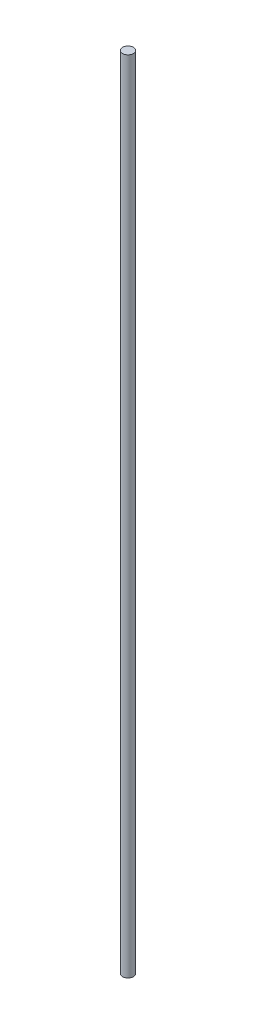
ISO-10303-21;
HEADER;
FILE_DESCRIPTION(('STEP AP214'),'2;1');
FILE_NAME('part.step','',(''),(''),'','','');
FILE_SCHEMA(('AUTOMOTIVE_DESIGN { 1 0 10303 214 1 1 1 1 }'));
ENDSEC;
DATA;
#1=APPLICATION_CONTEXT('core data for automotive mechanical design processes');
#2=APPLICATION_PROTOCOL_DEFINITION('international standard','automotive_design',2000,#1);
#3=PRODUCT_CONTEXT('',#1,'mechanical');
#4=PRODUCT('Part','Part','',(#3));
#5=PRODUCT_RELATED_PRODUCT_CATEGORY('part','',(#4));
#6=PRODUCT_DEFINITION_FORMATION('','',#4);
#7=PRODUCT_DEFINITION_CONTEXT('part definition',#1,'design');
#8=PRODUCT_DEFINITION('design','',#6,#7);
#9=PRODUCT_DEFINITION_SHAPE('','',#8);
#10=(LENGTH_UNIT() NAMED_UNIT(*) SI_UNIT(.MILLI.,.METRE.));
#11=(NAMED_UNIT(*) PLANE_ANGLE_UNIT() SI_UNIT($,.RADIAN.));
#12=(NAMED_UNIT(*) SI_UNIT($,.STERADIAN.) SOLID_ANGLE_UNIT());
#13=UNCERTAINTY_MEASURE_WITH_UNIT(LENGTH_MEASURE(1.E-05),#10,'distance_accuracy_value','');
#14=(GEOMETRIC_REPRESENTATION_CONTEXT(3) GLOBAL_UNCERTAINTY_ASSIGNED_CONTEXT((#13)) GLOBAL_UNIT_ASSIGNED_CONTEXT((#10,
#11,#12)) REPRESENTATION_CONTEXT('',''));
#15=CARTESIAN_POINT('',(0.,0.,0.));
#16=DIRECTION('',(0.,0.,1.));
#17=DIRECTION('',(1.,0.,0.));
#18=AXIS2_PLACEMENT_3D('',#15,#16,#17);
#19=CARTESIAN_POINT('',(0.,590.,0.));
#20=DIRECTION('',(0.,-1.,0.));
#21=DIRECTION('',(0.,0.,-1.));
#22=AXIS2_PLACEMENT_3D('',#19,#20,#21);
#23=CYLINDRICAL_SURFACE('',#22,4.);
#24=CARTESIAN_POINT('',(0.,590.,0.));
#25=DIRECTION('',(0.,1.,0.));
#26=DIRECTION('',(0.,0.,1.));
#27=AXIS2_PLACEMENT_3D('',#24,#25,#26);
#28=CIRCLE('',#27,4.);
#29=CARTESIAN_POINT('',(0.,590.,4.));
#30=VERTEX_POINT('',#29);
#31=EDGE_CURVE('E10',#30,#30,#28,.T.);
#32=ORIENTED_EDGE('',*,*,#31,.F.);
#33=EDGE_LOOP('',(#32));
#34=FACE_BOUND('',#33,.T.);
#35=CARTESIAN_POINT('',(0.,0.,0.));
#36=DIRECTION('',(0.,1.,0.));
#37=DIRECTION('',(0.,0.,1.));
#38=AXIS2_PLACEMENT_3D('',#35,#36,#37);
#39=CIRCLE('',#38,4.);
#40=CARTESIAN_POINT('',(0.,0.,4.));
#41=VERTEX_POINT('',#40);
#42=EDGE_CURVE('E38',#41,#41,#39,.T.);
#43=ORIENTED_EDGE('',*,*,#42,.T.);
#44=EDGE_LOOP('',(#43));
#45=FACE_BOUND('',#44,.T.);
#46=ADVANCED_FACE('F35',(#34,#45),#23,.T.);
#47=CARTESIAN_POINT('',(0.,590.,0.));
#48=DIRECTION('',(0.,1.,0.));
#49=DIRECTION('',(0.,0.,1.));
#50=AXIS2_PLACEMENT_3D('',#47,#48,#49);
#51=PLANE('',#50);
#52=ORIENTED_EDGE('',*,*,#31,.T.);
#53=EDGE_LOOP('',(#52));
#54=FACE_BOUND('',#53,.T.);
#55=ADVANCED_FACE('F50',(#54),#51,.T.);
#56=CARTESIAN_POINT('',(0.,0.,0.));
#57=DIRECTION('',(0.,1.,0.));
#58=DIRECTION('',(0.,0.,1.));
#59=AXIS2_PLACEMENT_3D('',#56,#57,#58);
#60=PLANE('',#59);
#61=ORIENTED_EDGE('',*,*,#42,.F.);
#62=EDGE_LOOP('',(#61));
#63=FACE_BOUND('',#62,.T.);
#64=ADVANCED_FACE('F48',(#63),#60,.F.);
#65=CLOSED_SHELL('',(#46,#55,#64));
#66=MANIFOLD_SOLID_BREP('B2',#65);
#67=ADVANCED_BREP_SHAPE_REPRESENTATION('',(#18,#66),#14);
#68=SHAPE_DEFINITION_REPRESENTATION(#9,#67);
ENDSEC;
END-ISO-10303-21;
